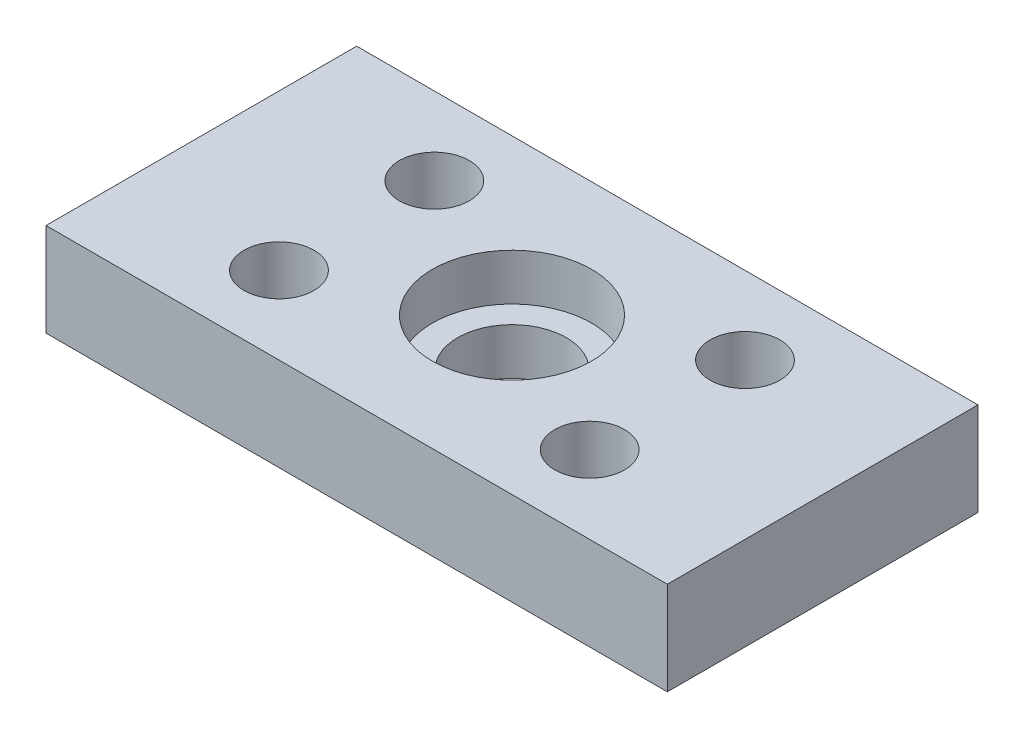
ISO-10303-21;
HEADER;
FILE_DESCRIPTION(('STEP AP214'),'2;1');
FILE_NAME('part.step','',(''),(''),'','','');
FILE_SCHEMA(('AUTOMOTIVE_DESIGN { 1 0 10303 214 1 1 1 1 }'));
ENDSEC;
DATA;
#1=APPLICATION_CONTEXT('core data for automotive mechanical design processes');
#2=APPLICATION_PROTOCOL_DEFINITION('international standard','automotive_design',2000,#1);
#3=PRODUCT_CONTEXT('',#1,'mechanical');
#4=PRODUCT('Part','Part','',(#3));
#5=PRODUCT_RELATED_PRODUCT_CATEGORY('part','',(#4));
#6=PRODUCT_DEFINITION_FORMATION('','',#4);
#7=PRODUCT_DEFINITION_CONTEXT('part definition',#1,'design');
#8=PRODUCT_DEFINITION('design','',#6,#7);
#9=PRODUCT_DEFINITION_SHAPE('','',#8);
#10=(LENGTH_UNIT() NAMED_UNIT(*) SI_UNIT(.MILLI.,.METRE.));
#11=(NAMED_UNIT(*) PLANE_ANGLE_UNIT() SI_UNIT($,.RADIAN.));
#12=(NAMED_UNIT(*) SI_UNIT($,.STERADIAN.) SOLID_ANGLE_UNIT());
#13=UNCERTAINTY_MEASURE_WITH_UNIT(LENGTH_MEASURE(1.E-05),#10,'distance_accuracy_value','');
#14=(GEOMETRIC_REPRESENTATION_CONTEXT(3) GLOBAL_UNCERTAINTY_ASSIGNED_CONTEXT((#13)) GLOBAL_UNIT_ASSIGNED_CONTEXT((#10,
#11,#12)) REPRESENTATION_CONTEXT('',''));
#15=CARTESIAN_POINT('',(0.,0.,0.));
#16=DIRECTION('',(0.,0.,1.));
#17=DIRECTION('',(1.,0.,0.));
#18=AXIS2_PLACEMENT_3D('',#15,#16,#17);
#19=CARTESIAN_POINT('',(0.,6.,0.));
#20=DIRECTION('',(0.,1.,0.));
#21=DIRECTION('',(0.,0.,1.));
#22=AXIS2_PLACEMENT_3D('',#19,#20,#21);
#23=PLANE('',#22);
#24=CARTESIAN_POINT('',(-39.9999999999999,6.,0.));
#25=DIRECTION('',(0.,1.,0.));
#26=DIRECTION('',(0.,0.,1.));
#27=AXIS2_PLACEMENT_3D('',#24,#25,#26);
#28=CIRCLE('',#27,5.125);
#29=CARTESIAN_POINT('',(-39.9999999999999,6.,5.125));
#30=VERTEX_POINT('',#29);
#31=EDGE_CURVE('E136',#30,#30,#28,.T.);
#32=ORIENTED_EDGE('',*,*,#31,.F.);
#33=EDGE_LOOP('',(#32));
#34=FACE_BOUND('',#33,.T.);
#35=DIRECTION('',(0.,0.,1.));
#36=VECTOR('',#35,1.);
#37=CARTESIAN_POINT('',(-19.9999999999999,6.,-10.));
#38=LINE('',#37,#36);
#39=CARTESIAN_POINT('',(-19.9999999999999,6.,-10.));
#40=VERTEX_POINT('',#39);
#41=CARTESIAN_POINT('',(-19.9999999999999,6.,10.));
#42=VERTEX_POINT('',#41);
#43=EDGE_CURVE('E54',#40,#42,#38,.T.);
#44=ORIENTED_EDGE('',*,*,#43,.F.);
#45=DIRECTION('',(-1.,0.,0.));
#46=VECTOR('',#45,1.);
#47=CARTESIAN_POINT('',(-60.,6.,-10.));
#48=LINE('',#47,#46);
#49=CARTESIAN_POINT('',(-60.,6.,-10.));
#50=VERTEX_POINT('',#49);
#51=EDGE_CURVE('E96',#40,#50,#48,.T.);
#52=ORIENTED_EDGE('',*,*,#51,.T.);
#53=DIRECTION('',(0.,0.,1.));
#54=VECTOR('',#53,1.);
#55=CARTESIAN_POINT('',(-60.,6.,-10.));
#56=LINE('',#55,#54);
#57=CARTESIAN_POINT('',(-60.,6.,10.));
#58=VERTEX_POINT('',#57);
#59=EDGE_CURVE('E63',#50,#58,#56,.T.);
#60=ORIENTED_EDGE('',*,*,#59,.T.);
#61=DIRECTION('',(1.,0.,0.));
#62=VECTOR('',#61,1.);
#63=CARTESIAN_POINT('',(-60.,6.,10.));
#64=LINE('',#63,#62);
#65=EDGE_CURVE('E90',#58,#42,#64,.T.);
#66=ORIENTED_EDGE('',*,*,#65,.T.);
#67=EDGE_LOOP('',(#44,#52,#60,#66));
#68=FACE_BOUND('',#67,.T.);
#69=CARTESIAN_POINT('',(-29.9999999999999,6.,5.));
#70=DIRECTION('',(0.,1.,0.));
#71=DIRECTION('',(0.,0.,1.));
#72=AXIS2_PLACEMENT_3D('',#69,#70,#71);
#73=CIRCLE('',#72,2.25);
#74=CARTESIAN_POINT('',(-29.9999999999999,6.,7.25));
#75=VERTEX_POINT('',#74);
#76=EDGE_CURVE('E113',#75,#75,#73,.T.);
#77=ORIENTED_EDGE('',*,*,#76,.F.);
#78=EDGE_LOOP('',(#77));
#79=FACE_BOUND('',#78,.T.);
#80=CARTESIAN_POINT('',(-50.,6.,-5.));
#81=DIRECTION('',(0.,1.,0.));
#82=DIRECTION('',(0.,0.,1.));
#83=AXIS2_PLACEMENT_3D('',#80,#81,#82);
#84=CIRCLE('',#83,2.25);
#85=CARTESIAN_POINT('',(-50.,6.,-2.75));
#86=VERTEX_POINT('',#85);
#87=EDGE_CURVE('E101',#86,#86,#84,.T.);
#88=ORIENTED_EDGE('',*,*,#87,.F.);
#89=EDGE_LOOP('',(#88));
#90=FACE_BOUND('',#89,.T.);
#91=CARTESIAN_POINT('',(-30.,6.,-5.));
#92=DIRECTION('',(0.,1.,0.));
#93=DIRECTION('',(0.,0.,1.));
#94=AXIS2_PLACEMENT_3D('',#91,#92,#93);
#95=CIRCLE('',#94,2.25);
#96=CARTESIAN_POINT('',(-30.,6.,-2.75));
#97=VERTEX_POINT('',#96);
#98=EDGE_CURVE('E107',#97,#97,#95,.T.);
#99=ORIENTED_EDGE('',*,*,#98,.F.);
#100=EDGE_LOOP('',(#99));
#101=FACE_BOUND('',#100,.T.);
#102=CARTESIAN_POINT('',(-49.9999999999999,6.,5.));
#103=DIRECTION('',(0.,1.,0.));
#104=DIRECTION('',(0.,0.,1.));
#105=AXIS2_PLACEMENT_3D('',#102,#103,#104);
#106=CIRCLE('',#105,2.25);
#107=CARTESIAN_POINT('',(-49.9999999999999,6.,7.25));
#108=VERTEX_POINT('',#107);
#109=EDGE_CURVE('E119',#108,#108,#106,.T.);
#110=ORIENTED_EDGE('',*,*,#109,.F.);
#111=EDGE_LOOP('',(#110));
#112=FACE_BOUND('',#111,.T.);
#113=ADVANCED_FACE('F39',(#34,#68,#79,#90,#101,#112),#23,.T.);
#114=CARTESIAN_POINT('',(0.,0.,0.));
#115=DIRECTION('',(0.,1.,0.));
#116=DIRECTION('',(0.,0.,1.));
#117=AXIS2_PLACEMENT_3D('',#114,#115,#116);
#118=PLANE('',#117);
#119=CARTESIAN_POINT('',(-39.9999999999999,0.,0.));
#120=DIRECTION('',(0.,1.,0.));
#121=DIRECTION('',(0.,0.,1.));
#122=AXIS2_PLACEMENT_3D('',#119,#120,#121);
#123=CIRCLE('',#122,3.5);
#124=CARTESIAN_POINT('',(-39.9999999999999,0.,3.5));
#125=VERTEX_POINT('',#124);
#126=EDGE_CURVE('E139',#125,#125,#123,.T.);
#127=ORIENTED_EDGE('',*,*,#126,.T.);
#128=EDGE_LOOP('',(#127));
#129=FACE_BOUND('',#128,.T.);
#130=DIRECTION('',(-1.,0.,0.));
#131=VECTOR('',#130,1.);
#132=CARTESIAN_POINT('',(-60.,0.,-10.));
#133=LINE('',#132,#131);
#134=CARTESIAN_POINT('',(-19.9999999999999,0.,-10.));
#135=VERTEX_POINT('',#134);
#136=CARTESIAN_POINT('',(-60.,0.,-10.));
#137=VERTEX_POINT('',#136);
#138=EDGE_CURVE('E84',#135,#137,#133,.T.);
#139=ORIENTED_EDGE('',*,*,#138,.F.);
#140=DIRECTION('',(0.,0.,1.));
#141=VECTOR('',#140,1.);
#142=CARTESIAN_POINT('',(-19.9999999999999,0.,-10.));
#143=LINE('',#142,#141);
#144=CARTESIAN_POINT('',(-19.9999999999999,0.,10.));
#145=VERTEX_POINT('',#144);
#146=EDGE_CURVE('E95',#135,#145,#143,.T.);
#147=ORIENTED_EDGE('',*,*,#146,.T.);
#148=DIRECTION('',(1.,0.,0.));
#149=VECTOR('',#148,1.);
#150=CARTESIAN_POINT('',(-60.,0.,10.));
#151=LINE('',#150,#149);
#152=CARTESIAN_POINT('',(-60.,0.,10.));
#153=VERTEX_POINT('',#152);
#154=EDGE_CURVE('E83',#153,#145,#151,.T.);
#155=ORIENTED_EDGE('',*,*,#154,.F.);
#156=DIRECTION('',(0.,0.,1.));
#157=VECTOR('',#156,1.);
#158=CARTESIAN_POINT('',(-60.,0.,-10.));
#159=LINE('',#158,#157);
#160=EDGE_CURVE('E75',#137,#153,#159,.T.);
#161=ORIENTED_EDGE('',*,*,#160,.F.);
#162=EDGE_LOOP('',(#139,#147,#155,#161));
#163=FACE_BOUND('',#162,.T.);
#164=CARTESIAN_POINT('',(-50.,0.,-5.));
#165=DIRECTION('',(0.,1.,0.));
#166=DIRECTION('',(0.,0.,1.));
#167=AXIS2_PLACEMENT_3D('',#164,#165,#166);
#168=CIRCLE('',#167,2.25);
#169=CARTESIAN_POINT('',(-50.,0.,-2.75));
#170=VERTEX_POINT('',#169);
#171=EDGE_CURVE('E104',#170,#170,#168,.T.);
#172=ORIENTED_EDGE('',*,*,#171,.T.);
#173=EDGE_LOOP('',(#172));
#174=FACE_BOUND('',#173,.T.);
#175=CARTESIAN_POINT('',(-30.,0.,-5.));
#176=DIRECTION('',(0.,1.,0.));
#177=DIRECTION('',(0.,0.,1.));
#178=AXIS2_PLACEMENT_3D('',#175,#176,#177);
#179=CIRCLE('',#178,2.25);
#180=CARTESIAN_POINT('',(-30.,0.,-2.75));
#181=VERTEX_POINT('',#180);
#182=EDGE_CURVE('E110',#181,#181,#179,.T.);
#183=ORIENTED_EDGE('',*,*,#182,.T.);
#184=EDGE_LOOP('',(#183));
#185=FACE_BOUND('',#184,.T.);
#186=CARTESIAN_POINT('',(-29.9999999999999,0.,5.));
#187=DIRECTION('',(0.,1.,0.));
#188=DIRECTION('',(0.,0.,1.));
#189=AXIS2_PLACEMENT_3D('',#186,#187,#188);
#190=CIRCLE('',#189,2.25);
#191=CARTESIAN_POINT('',(-29.9999999999999,0.,7.25));
#192=VERTEX_POINT('',#191);
#193=EDGE_CURVE('E116',#192,#192,#190,.T.);
#194=ORIENTED_EDGE('',*,*,#193,.T.);
#195=EDGE_LOOP('',(#194));
#196=FACE_BOUND('',#195,.T.);
#197=CARTESIAN_POINT('',(-49.9999999999999,0.,5.));
#198=DIRECTION('',(0.,1.,0.));
#199=DIRECTION('',(0.,0.,1.));
#200=AXIS2_PLACEMENT_3D('',#197,#198,#199);
#201=CIRCLE('',#200,2.25);
#202=CARTESIAN_POINT('',(-49.9999999999999,0.,7.25));
#203=VERTEX_POINT('',#202);
#204=EDGE_CURVE('E122',#203,#203,#201,.T.);
#205=ORIENTED_EDGE('',*,*,#204,.T.);
#206=EDGE_LOOP('',(#205));
#207=FACE_BOUND('',#206,.T.);
#208=ADVANCED_FACE('F92',(#129,#163,#174,#185,#196,#207),#118,.F.);
#209=CARTESIAN_POINT('',(-60.,6.,-10.));
#210=DIRECTION('',(0.,0.,1.));
#211=DIRECTION('',(1.,0.,0.));
#212=AXIS2_PLACEMENT_3D('',#209,#210,#211);
#213=PLANE('',#212);
#214=ORIENTED_EDGE('',*,*,#51,.F.);
#215=DIRECTION('',(0.,1.,0.));
#216=VECTOR('',#215,1.);
#217=CARTESIAN_POINT('',(-19.9999999999999,0.,-10.));
#218=LINE('',#217,#216);
#219=EDGE_CURVE('E125',#135,#40,#218,.T.);
#220=ORIENTED_EDGE('',*,*,#219,.F.);
#221=ORIENTED_EDGE('',*,*,#138,.T.);
#222=DIRECTION('',(0.,-1.,0.));
#223=VECTOR('',#222,1.);
#224=CARTESIAN_POINT('',(-60.,6.,-10.));
#225=LINE('',#224,#223);
#226=EDGE_CURVE('E12',#50,#137,#225,.T.);
#227=ORIENTED_EDGE('',*,*,#226,.F.);
#228=EDGE_LOOP('',(#214,#220,#221,#227));
#229=FACE_BOUND('',#228,.T.);
#230=ADVANCED_FACE('F41',(#229),#213,.F.);
#231=CARTESIAN_POINT('',(-60.,6.,-10.));
#232=DIRECTION('',(1.,0.,0.));
#233=DIRECTION('',(0.,0.,-1.));
#234=AXIS2_PLACEMENT_3D('',#231,#232,#233);
#235=PLANE('',#234);
#236=ORIENTED_EDGE('',*,*,#160,.T.);
#237=DIRECTION('',(0.,-1.,0.));
#238=VECTOR('',#237,1.);
#239=CARTESIAN_POINT('',(-60.,6.,10.));
#240=LINE('',#239,#238);
#241=EDGE_CURVE('E47',#58,#153,#240,.T.);
#242=ORIENTED_EDGE('',*,*,#241,.F.);
#243=ORIENTED_EDGE('',*,*,#59,.F.);
#244=ORIENTED_EDGE('',*,*,#226,.T.);
#245=EDGE_LOOP('',(#236,#242,#243,#244));
#246=FACE_BOUND('',#245,.T.);
#247=ADVANCED_FACE('F77',(#246),#235,.F.);
#248=CARTESIAN_POINT('',(-60.,6.,10.));
#249=DIRECTION('',(0.,0.,-1.));
#250=DIRECTION('',(-1.,0.,0.));
#251=AXIS2_PLACEMENT_3D('',#248,#249,#250);
#252=PLANE('',#251);
#253=ORIENTED_EDGE('',*,*,#154,.T.);
#254=DIRECTION('',(0.,1.,0.));
#255=VECTOR('',#254,1.);
#256=CARTESIAN_POINT('',(-19.9999999999999,0.,10.));
#257=LINE('',#256,#255);
#258=EDGE_CURVE('E128',#145,#42,#257,.T.);
#259=ORIENTED_EDGE('',*,*,#258,.T.);
#260=ORIENTED_EDGE('',*,*,#65,.F.);
#261=ORIENTED_EDGE('',*,*,#241,.T.);
#262=EDGE_LOOP('',(#253,#259,#260,#261));
#263=FACE_BOUND('',#262,.T.);
#264=ADVANCED_FACE('F88',(#263),#252,.F.);
#265=CARTESIAN_POINT('',(-50.,6.,-5.));
#266=DIRECTION('',(0.,-1.,0.));
#267=DIRECTION('',(0.,0.,-1.));
#268=AXIS2_PLACEMENT_3D('',#265,#266,#267);
#269=CYLINDRICAL_SURFACE('',#268,2.25);
#270=ORIENTED_EDGE('',*,*,#87,.T.);
#271=EDGE_LOOP('',(#270));
#272=FACE_BOUND('',#271,.T.);
#273=ORIENTED_EDGE('',*,*,#171,.F.);
#274=EDGE_LOOP('',(#273));
#275=FACE_BOUND('',#274,.T.);
#276=ADVANCED_FACE('F195',(#272,#275),#269,.F.);
#277=CARTESIAN_POINT('',(-30.,6.,-5.));
#278=DIRECTION('',(0.,-1.,0.));
#279=DIRECTION('',(0.,0.,-1.));
#280=AXIS2_PLACEMENT_3D('',#277,#278,#279);
#281=CYLINDRICAL_SURFACE('',#280,2.25);
#282=ORIENTED_EDGE('',*,*,#98,.T.);
#283=EDGE_LOOP('',(#282));
#284=FACE_BOUND('',#283,.T.);
#285=ORIENTED_EDGE('',*,*,#182,.F.);
#286=EDGE_LOOP('',(#285));
#287=FACE_BOUND('',#286,.T.);
#288=ADVANCED_FACE('F212',(#284,#287),#281,.F.);
#289=CARTESIAN_POINT('',(-29.9999999999999,6.,5.));
#290=DIRECTION('',(0.,-1.,0.));
#291=DIRECTION('',(0.,0.,-1.));
#292=AXIS2_PLACEMENT_3D('',#289,#290,#291);
#293=CYLINDRICAL_SURFACE('',#292,2.25);
#294=ORIENTED_EDGE('',*,*,#76,.T.);
#295=EDGE_LOOP('',(#294));
#296=FACE_BOUND('',#295,.T.);
#297=ORIENTED_EDGE('',*,*,#193,.F.);
#298=EDGE_LOOP('',(#297));
#299=FACE_BOUND('',#298,.T.);
#300=ADVANCED_FACE('F182',(#296,#299),#293,.F.);
#301=CARTESIAN_POINT('',(-49.9999999999999,6.,5.));
#302=DIRECTION('',(0.,-1.,0.));
#303=DIRECTION('',(0.,0.,-1.));
#304=AXIS2_PLACEMENT_3D('',#301,#302,#303);
#305=CYLINDRICAL_SURFACE('',#304,2.25);
#306=ORIENTED_EDGE('',*,*,#109,.T.);
#307=EDGE_LOOP('',(#306));
#308=FACE_BOUND('',#307,.T.);
#309=ORIENTED_EDGE('',*,*,#204,.F.);
#310=EDGE_LOOP('',(#309));
#311=FACE_BOUND('',#310,.T.);
#312=ADVANCED_FACE('F179',(#308,#311),#305,.F.);
#313=CARTESIAN_POINT('',(-19.9999999999999,0.,-10.));
#314=DIRECTION('',(-1.,0.,0.));
#315=DIRECTION('',(0.,0.,1.));
#316=AXIS2_PLACEMENT_3D('',#313,#314,#315);
#317=PLANE('',#316);
#318=ORIENTED_EDGE('',*,*,#43,.T.);
#319=ORIENTED_EDGE('',*,*,#258,.F.);
#320=ORIENTED_EDGE('',*,*,#146,.F.);
#321=ORIENTED_EDGE('',*,*,#219,.T.);
#322=EDGE_LOOP('',(#318,#319,#320,#321));
#323=FACE_BOUND('',#322,.T.);
#324=ADVANCED_FACE('F162',(#323),#317,.F.);
#325=CARTESIAN_POINT('',(-39.9999999999999,-14.4956890143242,0.));
#326=DIRECTION('',(0.,1.,0.));
#327=DIRECTION('',(0.,0.,1.));
#328=AXIS2_PLACEMENT_3D('',#325,#326,#327);
#329=CYLINDRICAL_SURFACE('',#328,5.125);
#330=CARTESIAN_POINT('',(-39.9999999999999,3.,0.));
#331=DIRECTION('',(0.,1.,0.));
#332=DIRECTION('',(0.,0.,1.));
#333=AXIS2_PLACEMENT_3D('',#330,#331,#332);
#334=CIRCLE('',#333,5.125);
#335=CARTESIAN_POINT('',(-39.9999999999999,3.,5.125));
#336=VERTEX_POINT('',#335);
#337=EDGE_CURVE('E132',#336,#336,#334,.F.);
#338=ORIENTED_EDGE('',*,*,#337,.T.);
#339=EDGE_LOOP('',(#338));
#340=FACE_BOUND('',#339,.T.);
#341=ORIENTED_EDGE('',*,*,#31,.T.);
#342=EDGE_LOOP('',(#341));
#343=FACE_BOUND('',#342,.T.);
#344=ADVANCED_FACE('F156',(#340,#343),#329,.F.);
#345=CARTESIAN_POINT('',(0.,3.,0.));
#346=DIRECTION('',(0.,1.,0.));
#347=DIRECTION('',(0.,0.,1.));
#348=AXIS2_PLACEMENT_3D('',#345,#346,#347);
#349=PLANE('',#348);
#350=CARTESIAN_POINT('',(-39.9999999999999,3.,0.));
#351=DIRECTION('',(0.,1.,0.));
#352=DIRECTION('',(0.,0.,1.));
#353=AXIS2_PLACEMENT_3D('',#350,#351,#352);
#354=CIRCLE('',#353,3.5);
#355=CARTESIAN_POINT('',(-39.9999999999999,3.,3.5));
#356=VERTEX_POINT('',#355);
#357=EDGE_CURVE('E140',#356,#356,#354,.T.);
#358=ORIENTED_EDGE('',*,*,#357,.F.);
#359=EDGE_LOOP('',(#358));
#360=FACE_BOUND('',#359,.T.);
#361=ORIENTED_EDGE('',*,*,#337,.F.);
#362=EDGE_LOOP('',(#361));
#363=FACE_BOUND('',#362,.T.);
#364=ADVANCED_FACE('F150',(#360,#363),#349,.T.);
#365=CARTESIAN_POINT('',(-39.9999999999999,0.,0.));
#366=DIRECTION('',(0.,1.,0.));
#367=DIRECTION('',(0.,0.,1.));
#368=AXIS2_PLACEMENT_3D('',#365,#366,#367);
#369=CYLINDRICAL_SURFACE('',#368,3.5);
#370=ORIENTED_EDGE('',*,*,#126,.F.);
#371=EDGE_LOOP('',(#370));
#372=FACE_BOUND('',#371,.T.);
#373=ORIENTED_EDGE('',*,*,#357,.T.);
#374=EDGE_LOOP('',(#373));
#375=FACE_BOUND('',#374,.T.);
#376=ADVANCED_FACE('F147',(#372,#375),#369,.F.);
#377=CLOSED_SHELL('',(#113,#208,#230,#247,#264,#276,#288,#300,#312,#324,#344,#364,#376));
#378=MANIFOLD_SOLID_BREP('B2',#377);
#379=ADVANCED_BREP_SHAPE_REPRESENTATION('',(#18,#378),#14);
#380=SHAPE_DEFINITION_REPRESENTATION(#9,#379);
ENDSEC;
END-ISO-10303-21;
